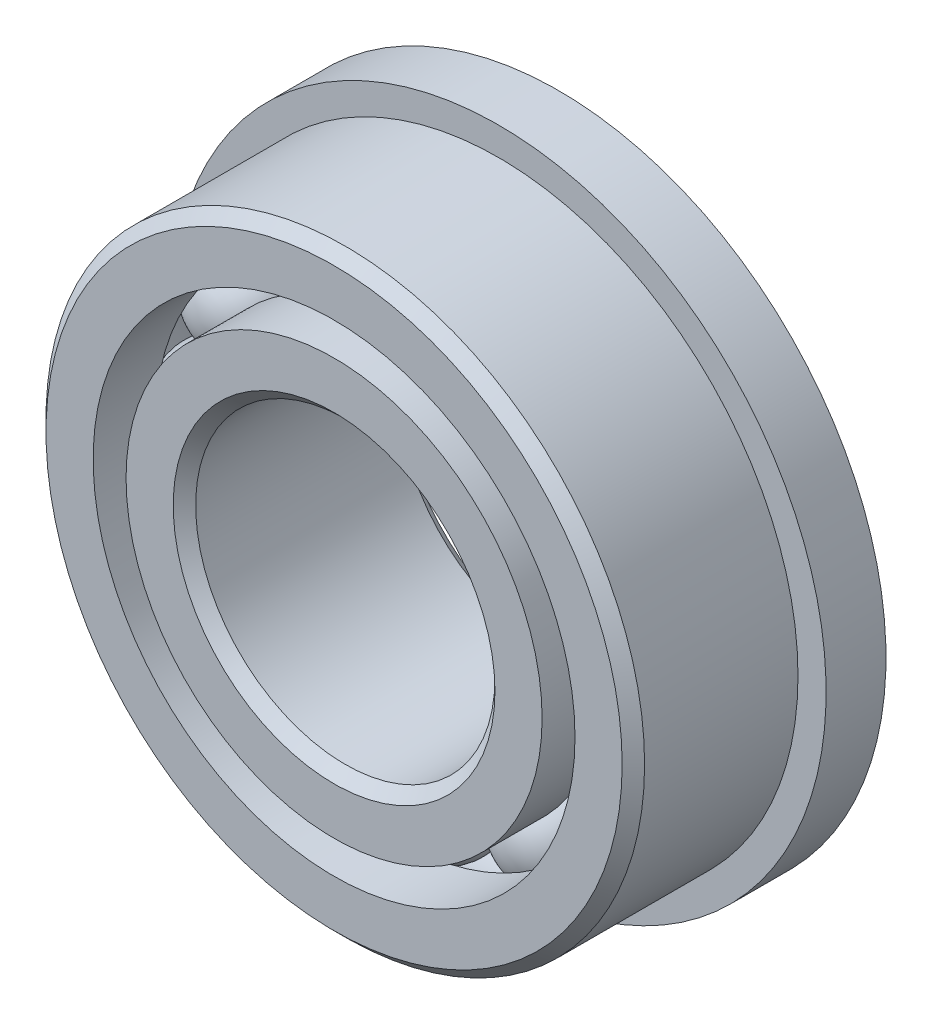
ISO-10303-21;
HEADER;
FILE_DESCRIPTION(('STEP AP214'),'2;1');
FILE_NAME('part.step','',(''),(''),'','','');
FILE_SCHEMA(('AUTOMOTIVE_DESIGN { 1 0 10303 214 1 1 1 1 }'));
ENDSEC;
DATA;
#1=APPLICATION_CONTEXT('core data for automotive mechanical design processes');
#2=APPLICATION_PROTOCOL_DEFINITION('international standard','automotive_design',2000,#1);
#3=PRODUCT_CONTEXT('',#1,'mechanical');
#4=PRODUCT('Part','Part','',(#3));
#5=PRODUCT_RELATED_PRODUCT_CATEGORY('part','',(#4));
#6=PRODUCT_DEFINITION_FORMATION('','',#4);
#7=PRODUCT_DEFINITION_CONTEXT('part definition',#1,'design');
#8=PRODUCT_DEFINITION('design','',#6,#7);
#9=PRODUCT_DEFINITION_SHAPE('','',#8);
#10=(LENGTH_UNIT() NAMED_UNIT(*) SI_UNIT(.MILLI.,.METRE.));
#11=(NAMED_UNIT(*) PLANE_ANGLE_UNIT() SI_UNIT($,.RADIAN.));
#12=(NAMED_UNIT(*) SI_UNIT($,.STERADIAN.) SOLID_ANGLE_UNIT());
#13=UNCERTAINTY_MEASURE_WITH_UNIT(LENGTH_MEASURE(1.E-05),#10,'distance_accuracy_value','');
#14=(GEOMETRIC_REPRESENTATION_CONTEXT(3) GLOBAL_UNCERTAINTY_ASSIGNED_CONTEXT((#13)) GLOBAL_UNIT_ASSIGNED_CONTEXT((#10,
#11,#12)) REPRESENTATION_CONTEXT('',''));
#15=CARTESIAN_POINT('',(0.,0.,0.));
#16=DIRECTION('',(0.,0.,1.));
#17=DIRECTION('',(1.,0.,0.));
#18=AXIS2_PLACEMENT_3D('',#15,#16,#17);
#19=CARTESIAN_POINT('',(-2.38124999999995,4.12444598552342,0.));
#20=DIRECTION('',(0.,0.,1.));
#21=DIRECTION('',(-0.499999999999989,0.866025403784445,0.));
#22=AXIS2_PLACEMENT_3D('',#19,#20,#21);
#23=SPHERICAL_SURFACE('',#22,1.11436144103197);
#24=CARTESIAN_POINT('',(-2.38124999999995,4.12444598552342,1.11436144103197));
#25=VERTEX_POINT('',#24);
#26=VERTEX_LOOP('',#25);
#27=FACE_BOUND('',#26,.T.);
#28=ADVANCED_FACE('F37',(#27),#23,.T.);
#29=CLOSED_SHELL('',(#28));
#30=MANIFOLD_SOLID_BREP('B2',#29);
#31=CARTESIAN_POINT('',(-4.12444598552336,2.38125000000005,0.));
#32=DIRECTION('',(0.,0.,1.));
#33=DIRECTION('',(-0.866025403784433,0.50000000000001,0.));
#34=AXIS2_PLACEMENT_3D('',#31,#32,#33);
#35=SPHERICAL_SURFACE('',#34,1.11436144103197);
#36=CARTESIAN_POINT('',(-4.12444598552336,2.38125000000005,1.11436144103197));
#37=VERTEX_POINT('',#36);
#38=VERTEX_LOOP('',#37);
#39=FACE_BOUND('',#38,.T.);
#40=ADVANCED_FACE('F57',(#39),#35,.T.);
#41=CLOSED_SHELL('',(#40));
#42=MANIFOLD_SOLID_BREP('B6',#41);
#43=CARTESIAN_POINT('',(-4.7625,0.,0.));
#44=DIRECTION('',(0.,0.,1.));
#45=DIRECTION('',(-1.,0.,0.));
#46=AXIS2_PLACEMENT_3D('',#43,#44,#45);
#47=SPHERICAL_SURFACE('',#46,1.11436144103197);
#48=CARTESIAN_POINT('',(-4.7625,0.,1.11436144103197));
#49=VERTEX_POINT('',#48);
#50=VERTEX_LOOP('',#49);
#51=FACE_BOUND('',#50,.T.);
#52=ADVANCED_FACE('F77',(#51),#47,.T.);
#53=CLOSED_SHELL('',(#52));
#54=MANIFOLD_SOLID_BREP('B33',#53);
#55=CARTESIAN_POINT('',(-4.12444598552341,-2.38124999999996,0.));
#56=DIRECTION('',(0.,0.,1.));
#57=DIRECTION('',(-0.866025403784443,-0.499999999999992,0.));
#58=AXIS2_PLACEMENT_3D('',#55,#56,#57);
#59=SPHERICAL_SURFACE('',#58,1.11436144103197);
#60=CARTESIAN_POINT('',(-4.12444598552341,-2.38124999999996,1.11436144103197));
#61=VERTEX_POINT('',#60);
#62=VERTEX_LOOP('',#61);
#63=FACE_BOUND('',#62,.T.);
#64=ADVANCED_FACE('F97',(#63),#59,.T.);
#65=CLOSED_SHELL('',(#64));
#66=MANIFOLD_SOLID_BREP('B53',#65);
#67=CARTESIAN_POINT('',(-2.38125000000003,-4.12444598552337,0.));
#68=DIRECTION('',(0.,0.,1.));
#69=DIRECTION('',(-0.500000000000007,-0.866025403784435,0.));
#70=AXIS2_PLACEMENT_3D('',#67,#68,#69);
#71=SPHERICAL_SURFACE('',#70,1.11436144103197);
#72=CARTESIAN_POINT('',(-2.38125000000003,-4.12444598552337,1.11436144103197));
#73=VERTEX_POINT('',#72);
#74=VERTEX_LOOP('',#73);
#75=FACE_BOUND('',#74,.T.);
#76=ADVANCED_FACE('F117',(#75),#71,.T.);
#77=CLOSED_SHELL('',(#76));
#78=MANIFOLD_SOLID_BREP('B73',#77);
#79=CARTESIAN_POINT('',(0.,-4.7625,0.));
#80=DIRECTION('',(0.,0.,1.));
#81=DIRECTION('',(0.,-1.,0.));
#82=AXIS2_PLACEMENT_3D('',#79,#80,#81);
#83=SPHERICAL_SURFACE('',#82,1.11436144103197);
#84=CARTESIAN_POINT('',(0.,-4.7625,1.11436144103197));
#85=VERTEX_POINT('',#84);
#86=VERTEX_LOOP('',#85);
#87=FACE_BOUND('',#86,.T.);
#88=ADVANCED_FACE('F137',(#87),#83,.T.);
#89=CLOSED_SHELL('',(#88));
#90=MANIFOLD_SOLID_BREP('B93',#89);
#91=CARTESIAN_POINT('',(2.38124999999998,-4.1244459855234,0.));
#92=DIRECTION('',(0.,0.,1.));
#93=DIRECTION('',(0.499999999999995,-0.866025403784442,0.));
#94=AXIS2_PLACEMENT_3D('',#91,#92,#93);
#95=SPHERICAL_SURFACE('',#94,1.11436144103197);
#96=CARTESIAN_POINT('',(2.38124999999998,-4.1244459855234,1.11436144103197));
#97=VERTEX_POINT('',#96);
#98=VERTEX_LOOP('',#97);
#99=FACE_BOUND('',#98,.T.);
#100=ADVANCED_FACE('F157',(#99),#95,.T.);
#101=CLOSED_SHELL('',(#100));
#102=MANIFOLD_SOLID_BREP('B113',#101);
#103=CARTESIAN_POINT('',(4.12444598552338,-2.38125000000002,0.));
#104=DIRECTION('',(0.,0.,1.));
#105=DIRECTION('',(0.866025403784436,-0.500000000000004,0.));
#106=AXIS2_PLACEMENT_3D('',#103,#104,#105);
#107=SPHERICAL_SURFACE('',#106,1.11436144103197);
#108=CARTESIAN_POINT('',(4.12444598552338,-2.38125000000002,1.11436144103197));
#109=VERTEX_POINT('',#108);
#110=VERTEX_LOOP('',#109);
#111=FACE_BOUND('',#110,.T.);
#112=ADVANCED_FACE('F177',(#111),#107,.T.);
#113=CLOSED_SHELL('',(#112));
#114=MANIFOLD_SOLID_BREP('B133',#113);
#115=CARTESIAN_POINT('',(4.7625,0.,0.));
#116=DIRECTION('',(0.,0.,1.));
#117=DIRECTION('',(1.,0.,0.));
#118=AXIS2_PLACEMENT_3D('',#115,#116,#117);
#119=SPHERICAL_SURFACE('',#118,1.11436144103197);
#120=CARTESIAN_POINT('',(4.7625,0.,1.11436144103197));
#121=VERTEX_POINT('',#120);
#122=VERTEX_LOOP('',#121);
#123=FACE_BOUND('',#122,.T.);
#124=ADVANCED_FACE('F197',(#123),#119,.T.);
#125=CLOSED_SHELL('',(#124));
#126=MANIFOLD_SOLID_BREP('B153',#125);
#127=CARTESIAN_POINT('',(4.12444598552339,2.38124999999999,0.));
#128=DIRECTION('',(0.,0.,1.));
#129=DIRECTION('',(0.86602540378444,0.499999999999998,0.));
#130=AXIS2_PLACEMENT_3D('',#127,#128,#129);
#131=SPHERICAL_SURFACE('',#130,1.11436144103197);
#132=CARTESIAN_POINT('',(4.12444598552339,2.38124999999999,1.11436144103197));
#133=VERTEX_POINT('',#132);
#134=VERTEX_LOOP('',#133);
#135=FACE_BOUND('',#134,.T.);
#136=ADVANCED_FACE('F217',(#135),#131,.T.);
#137=CLOSED_SHELL('',(#136));
#138=MANIFOLD_SOLID_BREP('B173',#137);
#139=CARTESIAN_POINT('',(2.38125,4.12444598552339,0.));
#140=DIRECTION('',(0.,0.,1.));
#141=DIRECTION('',(0.500000000000001,0.866025403784438,0.));
#142=AXIS2_PLACEMENT_3D('',#139,#140,#141);
#143=SPHERICAL_SURFACE('',#142,1.11436144103197);
#144=CARTESIAN_POINT('',(2.38125,4.12444598552339,1.11436144103197));
#145=VERTEX_POINT('',#144);
#146=VERTEX_LOOP('',#145);
#147=FACE_BOUND('',#146,.T.);
#148=ADVANCED_FACE('F237',(#147),#143,.T.);
#149=CLOSED_SHELL('',(#148));
#150=MANIFOLD_SOLID_BREP('B193',#149);
#151=CARTESIAN_POINT('',(0.,4.7625,0.));
#152=DIRECTION('',(0.,0.,1.));
#153=DIRECTION('',(0.,1.,0.));
#154=AXIS2_PLACEMENT_3D('',#151,#152,#153);
#155=SPHERICAL_SURFACE('',#154,1.11436144103197);
#156=CARTESIAN_POINT('',(0.,4.7625,1.11436144103197));
#157=VERTEX_POINT('',#156);
#158=VERTEX_LOOP('',#157);
#159=FACE_BOUND('',#158,.T.);
#160=ADVANCED_FACE('F259',(#159),#155,.T.);
#161=CLOSED_SHELL('',(#160));
#162=MANIFOLD_SOLID_BREP('B213',#161);
#163=CARTESIAN_POINT('',(0.,4.4135989010989,2.38125));
#164=DIRECTION('',(0.,0.,-1.));
#165=DIRECTION('',(-1.,0.,0.));
#166=AXIS2_PLACEMENT_3D('',#163,#164,#165);
#167=PLANE('',#166);
#168=CARTESIAN_POINT('',(0.,0.,2.38125));
#169=DIRECTION('',(0.,0.,1.));
#170=DIRECTION('',(1.,0.,0.));
#171=AXIS2_PLACEMENT_3D('',#168,#169,#170);
#172=CIRCLE('',#171,3.413125);
#173=CARTESIAN_POINT('',(3.413125,0.,2.38125));
#174=VERTEX_POINT('',#173);
#175=EDGE_CURVE('E306',#174,#174,#172,.T.);
#176=ORIENTED_EDGE('',*,*,#175,.F.);
#177=EDGE_LOOP('',(#176));
#178=FACE_BOUND('',#177,.T.);
#179=CARTESIAN_POINT('',(0.,0.,2.38125));
#180=DIRECTION('',(0.,0.,1.));
#181=DIRECTION('',(1.,0.,0.));
#182=AXIS2_PLACEMENT_3D('',#179,#180,#181);
#183=CIRCLE('',#182,4.4135989010989);
#184=CARTESIAN_POINT('',(4.4135989010989,0.,2.38125));
#185=VERTEX_POINT('',#184);
#186=EDGE_CURVE('E258',#185,#185,#183,.T.);
#187=ORIENTED_EDGE('',*,*,#186,.T.);
#188=EDGE_LOOP('',(#187));
#189=FACE_BOUND('',#188,.T.);
#190=ADVANCED_FACE('F278',(#178,#189),#167,.F.);
#191=CARTESIAN_POINT('',(0.,0.,2.38125));
#192=DIRECTION('',(0.,0.,1.));
#193=DIRECTION('',(1.,0.,0.));
#194=AXIS2_PLACEMENT_3D('',#191,#192,#193);
#195=CYLINDRICAL_SURFACE('',#194,4.4135989010989);
#196=ORIENTED_EDGE('',*,*,#186,.F.);
#197=EDGE_LOOP('',(#196));
#198=FACE_BOUND('',#197,.T.);
#199=CARTESIAN_POINT('',(0.,0.,1.05833333333333));
#200=DIRECTION('',(0.,0.,1.));
#201=DIRECTION('',(1.,0.,0.));
#202=AXIS2_PLACEMENT_3D('',#199,#200,#201);
#203=CIRCLE('',#202,4.4135989010989);
#204=CARTESIAN_POINT('',(4.4135989010989,0.,1.05833333333333));
#205=VERTEX_POINT('',#204);
#206=EDGE_CURVE('E284',#205,#205,#203,.T.);
#207=ORIENTED_EDGE('',*,*,#206,.T.);
#208=EDGE_LOOP('',(#207));
#209=FACE_BOUND('',#208,.T.);
#210=ADVANCED_FACE('F313',(#198,#209),#195,.T.);
#211=CARTESIAN_POINT('',(0.,0.,0.));
#212=DIRECTION('',(0.,0.,1.));
#213=DIRECTION('',(1.,0.,0.));
#214=AXIS2_PLACEMENT_3D('',#211,#212,#213);
#215=TOROIDAL_SURFACE('',#214,4.7625,1.11436144103197);
#216=ORIENTED_EDGE('',*,*,#206,.F.);
#217=EDGE_LOOP('',(#216));
#218=FACE_BOUND('',#217,.T.);
#219=CARTESIAN_POINT('',(0.,0.,-1.05833333333333));
#220=DIRECTION('',(0.,0.,1.));
#221=DIRECTION('',(1.,0.,0.));
#222=AXIS2_PLACEMENT_3D('',#219,#220,#221);
#223=CIRCLE('',#222,4.4135989010989);
#224=CARTESIAN_POINT('',(4.4135989010989,0.,-1.05833333333333));
#225=VERTEX_POINT('',#224);
#226=EDGE_CURVE('E288',#225,#225,#223,.T.);
#227=ORIENTED_EDGE('',*,*,#226,.T.);
#228=EDGE_LOOP('',(#227));
#229=FACE_BOUND('',#228,.T.);
#230=ADVANCED_FACE('F317',(#218,#229),#215,.F.);
#231=CARTESIAN_POINT('',(0.,0.,2.38125));
#232=DIRECTION('',(0.,0.,1.));
#233=DIRECTION('',(1.,0.,0.));
#234=AXIS2_PLACEMENT_3D('',#231,#232,#233);
#235=CYLINDRICAL_SURFACE('',#234,4.4135989010989);
#236=ORIENTED_EDGE('',*,*,#226,.F.);
#237=EDGE_LOOP('',(#236));
#238=FACE_BOUND('',#237,.T.);
#239=CARTESIAN_POINT('',(0.,0.,-2.38125));
#240=DIRECTION('',(0.,0.,1.));
#241=DIRECTION('',(1.,0.,0.));
#242=AXIS2_PLACEMENT_3D('',#239,#240,#241);
#243=CIRCLE('',#242,4.4135989010989);
#244=CARTESIAN_POINT('',(4.4135989010989,0.,-2.38125));
#245=VERTEX_POINT('',#244);
#246=EDGE_CURVE('E292',#245,#245,#243,.T.);
#247=ORIENTED_EDGE('',*,*,#246,.T.);
#248=EDGE_LOOP('',(#247));
#249=FACE_BOUND('',#248,.T.);
#250=ADVANCED_FACE('F322',(#238,#249),#235,.T.);
#251=CARTESIAN_POINT('',(0.,3.413125,-2.38125));
#252=DIRECTION('',(0.,0.,1.));
#253=DIRECTION('',(1.,0.,0.));
#254=AXIS2_PLACEMENT_3D('',#251,#252,#253);
#255=PLANE('',#254);
#256=ORIENTED_EDGE('',*,*,#246,.F.);
#257=EDGE_LOOP('',(#256));
#258=FACE_BOUND('',#257,.T.);
#259=CARTESIAN_POINT('',(0.,0.,-2.38125));
#260=DIRECTION('',(0.,0.,1.));
#261=DIRECTION('',(1.,0.,0.));
#262=AXIS2_PLACEMENT_3D('',#259,#260,#261);
#263=CIRCLE('',#262,3.413125);
#264=CARTESIAN_POINT('',(3.413125,0.,-2.38125));
#265=VERTEX_POINT('',#264);
#266=EDGE_CURVE('E297',#265,#265,#263,.T.);
#267=ORIENTED_EDGE('',*,*,#266,.T.);
#268=EDGE_LOOP('',(#267));
#269=FACE_BOUND('',#268,.T.);
#270=ADVANCED_FACE('F328',(#258,#269),#255,.F.);
#271=CARTESIAN_POINT('',(0.,0.,-2.143125));
#272=DIRECTION('',(0.,0.,-1.));
#273=DIRECTION('',(-1.,0.,0.));
#274=AXIS2_PLACEMENT_3D('',#271,#272,#273);
#275=CONICAL_SURFACE('',#274,3.175,0.785398163397447);
#276=ORIENTED_EDGE('',*,*,#266,.F.);
#277=EDGE_LOOP('',(#276));
#278=FACE_BOUND('',#277,.T.);
#279=CARTESIAN_POINT('',(0.,0.,-2.143125));
#280=DIRECTION('',(0.,0.,1.));
#281=DIRECTION('',(1.,0.,0.));
#282=AXIS2_PLACEMENT_3D('',#279,#280,#281);
#283=CIRCLE('',#282,3.175);
#284=CARTESIAN_POINT('',(3.175,0.,-2.143125));
#285=VERTEX_POINT('',#284);
#286=EDGE_CURVE('E300',#285,#285,#283,.T.);
#287=ORIENTED_EDGE('',*,*,#286,.T.);
#288=EDGE_LOOP('',(#287));
#289=FACE_BOUND('',#288,.T.);
#290=ADVANCED_FACE('F332',(#278,#289),#275,.F.);
#291=CARTESIAN_POINT('',(0.,0.,2.38125));
#292=DIRECTION('',(0.,0.,1.));
#293=DIRECTION('',(1.,0.,0.));
#294=AXIS2_PLACEMENT_3D('',#291,#292,#293);
#295=CYLINDRICAL_SURFACE('',#294,3.175);
#296=ORIENTED_EDGE('',*,*,#286,.F.);
#297=EDGE_LOOP('',(#296));
#298=FACE_BOUND('',#297,.T.);
#299=CARTESIAN_POINT('',(0.,0.,2.143125));
#300=DIRECTION('',(0.,0.,1.));
#301=DIRECTION('',(1.,0.,0.));
#302=AXIS2_PLACEMENT_3D('',#299,#300,#301);
#303=CIRCLE('',#302,3.175);
#304=CARTESIAN_POINT('',(3.175,0.,2.143125));
#305=VERTEX_POINT('',#304);
#306=EDGE_CURVE('E303',#305,#305,#303,.T.);
#307=ORIENTED_EDGE('',*,*,#306,.T.);
#308=EDGE_LOOP('',(#307));
#309=FACE_BOUND('',#308,.T.);
#310=ADVANCED_FACE('F336',(#298,#309),#295,.F.);
#311=CARTESIAN_POINT('',(0.,0.,2.38125));
#312=DIRECTION('',(0.,0.,1.));
#313=DIRECTION('',(1.,0.,0.));
#314=AXIS2_PLACEMENT_3D('',#311,#312,#313);
#315=CONICAL_SURFACE('',#314,3.413125,0.785398163397451);
#316=ORIENTED_EDGE('',*,*,#306,.F.);
#317=EDGE_LOOP('',(#316));
#318=FACE_BOUND('',#317,.T.);
#319=ORIENTED_EDGE('',*,*,#175,.T.);
#320=EDGE_LOOP('',(#319));
#321=FACE_BOUND('',#320,.T.);
#322=ADVANCED_FACE('F310',(#318,#321),#315,.F.);
#323=CLOSED_SHELL('',(#190,#210,#230,#250,#270,#290,#310,#322));
#324=MANIFOLD_SOLID_BREP('B233',#323);
#325=CARTESIAN_POINT('',(0.,0.,2.143125));
#326=DIRECTION('',(0.,0.,-1.));
#327=DIRECTION('',(-1.,0.,0.));
#328=AXIS2_PLACEMENT_3D('',#325,#326,#327);
#329=CONICAL_SURFACE('',#328,6.35,0.785398163397447);
#330=CARTESIAN_POINT('',(0.,0.,2.38125));
#331=DIRECTION('',(0.,0.,1.));
#332=DIRECTION('',(1.,0.,0.));
#333=AXIS2_PLACEMENT_3D('',#330,#331,#332);
#334=CIRCLE('',#333,6.111875);
#335=CARTESIAN_POINT('',(6.111875,0.,2.38125));
#336=VERTEX_POINT('',#335);
#337=EDGE_CURVE('E421',#336,#336,#334,.T.);
#338=ORIENTED_EDGE('',*,*,#337,.F.);
#339=EDGE_LOOP('',(#338));
#340=FACE_BOUND('',#339,.T.);
#341=CARTESIAN_POINT('',(0.,0.,2.143125));
#342=DIRECTION('',(0.,0.,1.));
#343=DIRECTION('',(1.,0.,0.));
#344=AXIS2_PLACEMENT_3D('',#341,#342,#343);
#345=CIRCLE('',#344,6.35);
#346=CARTESIAN_POINT('',(6.35,0.,2.143125));
#347=VERTEX_POINT('',#346);
#348=EDGE_CURVE('E277',#347,#347,#345,.T.);
#349=ORIENTED_EDGE('',*,*,#348,.T.);
#350=EDGE_LOOP('',(#349));
#351=FACE_BOUND('',#350,.T.);
#352=ADVANCED_FACE('F399',(#340,#351),#329,.T.);
#353=CARTESIAN_POINT('',(0.,0.,2.38125));
#354=DIRECTION('',(0.,0.,1.));
#355=DIRECTION('',(1.,0.,0.));
#356=AXIS2_PLACEMENT_3D('',#353,#354,#355);
#357=CYLINDRICAL_SURFACE('',#356,6.35);
#358=CARTESIAN_POINT('',(0.,0.,-1.11125));
#359=DIRECTION('',(0.,0.,1.));
#360=DIRECTION('',(1.,0.,0.));
#361=AXIS2_PLACEMENT_3D('',#358,#359,#360);
#362=CIRCLE('',#361,6.35);
#363=CARTESIAN_POINT('',(6.35,0.,-1.11125));
#364=VERTEX_POINT('',#363);
#365=EDGE_CURVE('E402',#364,#364,#362,.T.);
#366=ORIENTED_EDGE('',*,*,#365,.T.);
#367=EDGE_LOOP('',(#366));
#368=FACE_BOUND('',#367,.T.);
#369=ORIENTED_EDGE('',*,*,#348,.F.);
#370=EDGE_LOOP('',(#369));
#371=FACE_BOUND('',#370,.T.);
#372=ADVANCED_FACE('F442',(#368,#371),#357,.T.);
#373=CARTESIAN_POINT('',(0.,6.111875,-2.38125));
#374=DIRECTION('',(0.,0.,1.));
#375=DIRECTION('',(1.,0.,0.));
#376=AXIS2_PLACEMENT_3D('',#373,#374,#375);
#377=PLANE('',#376);
#378=CARTESIAN_POINT('',(0.,0.,-2.38125));
#379=DIRECTION('',(0.,0.,1.));
#380=DIRECTION('',(1.,0.,0.));
#381=AXIS2_PLACEMENT_3D('',#378,#379,#380);
#382=CIRCLE('',#381,5.1114010989011);
#383=CARTESIAN_POINT('',(5.1114010989011,0.,-2.38125));
#384=VERTEX_POINT('',#383);
#385=EDGE_CURVE('E406',#384,#384,#382,.T.);
#386=ORIENTED_EDGE('',*,*,#385,.T.);
#387=EDGE_LOOP('',(#386));
#388=FACE_BOUND('',#387,.T.);
#389=CARTESIAN_POINT('',(0.,0.,-2.38125));
#390=DIRECTION('',(0.,0.,-1.));
#391=DIRECTION('',(-1.,0.,0.));
#392=AXIS2_PLACEMENT_3D('',#389,#390,#391);
#393=CIRCLE('',#392,6.9469);
#394=CARTESIAN_POINT('',(-6.9469,0.,-2.38125));
#395=VERTEX_POINT('',#394);
#396=EDGE_CURVE('E424',#395,#395,#393,.T.);
#397=ORIENTED_EDGE('',*,*,#396,.T.);
#398=EDGE_LOOP('',(#397));
#399=FACE_BOUND('',#398,.T.);
#400=ADVANCED_FACE('F445',(#388,#399),#377,.F.);
#401=CARTESIAN_POINT('',(0.,0.,2.38125));
#402=DIRECTION('',(0.,0.,1.));
#403=DIRECTION('',(1.,0.,0.));
#404=AXIS2_PLACEMENT_3D('',#401,#402,#403);
#405=CYLINDRICAL_SURFACE('',#404,5.1114010989011);
#406=ORIENTED_EDGE('',*,*,#385,.F.);
#407=EDGE_LOOP('',(#406));
#408=FACE_BOUND('',#407,.T.);
#409=CARTESIAN_POINT('',(0.,0.,-1.05833333333333));
#410=DIRECTION('',(0.,0.,1.));
#411=DIRECTION('',(1.,0.,0.));
#412=AXIS2_PLACEMENT_3D('',#409,#410,#411);
#413=CIRCLE('',#412,5.1114010989011);
#414=CARTESIAN_POINT('',(5.1114010989011,0.,-1.05833333333333));
#415=VERTEX_POINT('',#414);
#416=EDGE_CURVE('E410',#415,#415,#413,.T.);
#417=ORIENTED_EDGE('',*,*,#416,.T.);
#418=EDGE_LOOP('',(#417));
#419=FACE_BOUND('',#418,.T.);
#420=ADVANCED_FACE('F450',(#408,#419),#405,.F.);
#421=CARTESIAN_POINT('',(0.,0.,0.));
#422=DIRECTION('',(0.,0.,1.));
#423=DIRECTION('',(1.,0.,0.));
#424=AXIS2_PLACEMENT_3D('',#421,#422,#423);
#425=TOROIDAL_SURFACE('',#424,4.7625,1.11436144103197);
#426=ORIENTED_EDGE('',*,*,#416,.F.);
#427=EDGE_LOOP('',(#426));
#428=FACE_BOUND('',#427,.T.);
#429=CARTESIAN_POINT('',(0.,0.,1.05833333333333));
#430=DIRECTION('',(0.,0.,1.));
#431=DIRECTION('',(1.,0.,0.));
#432=AXIS2_PLACEMENT_3D('',#429,#430,#431);
#433=CIRCLE('',#432,5.1114010989011);
#434=CARTESIAN_POINT('',(5.1114010989011,0.,1.05833333333333));
#435=VERTEX_POINT('',#434);
#436=EDGE_CURVE('E415',#435,#435,#433,.T.);
#437=ORIENTED_EDGE('',*,*,#436,.T.);
#438=EDGE_LOOP('',(#437));
#439=FACE_BOUND('',#438,.T.);
#440=ADVANCED_FACE('F457',(#428,#439),#425,.F.);
#441=CARTESIAN_POINT('',(0.,0.,2.38125));
#442=DIRECTION('',(0.,0.,1.));
#443=DIRECTION('',(1.,0.,0.));
#444=AXIS2_PLACEMENT_3D('',#441,#442,#443);
#445=CYLINDRICAL_SURFACE('',#444,5.1114010989011);
#446=ORIENTED_EDGE('',*,*,#436,.F.);
#447=EDGE_LOOP('',(#446));
#448=FACE_BOUND('',#447,.T.);
#449=CARTESIAN_POINT('',(0.,0.,2.38125));
#450=DIRECTION('',(0.,0.,1.));
#451=DIRECTION('',(1.,0.,0.));
#452=AXIS2_PLACEMENT_3D('',#449,#450,#451);
#453=CIRCLE('',#452,5.1114010989011);
#454=CARTESIAN_POINT('',(5.1114010989011,0.,2.38125));
#455=VERTEX_POINT('',#454);
#456=EDGE_CURVE('E418',#455,#455,#453,.T.);
#457=ORIENTED_EDGE('',*,*,#456,.T.);
#458=EDGE_LOOP('',(#457));
#459=FACE_BOUND('',#458,.T.);
#460=ADVANCED_FACE('F461',(#448,#459),#445,.F.);
#461=CARTESIAN_POINT('',(0.,6.111875,2.38125));
#462=DIRECTION('',(0.,0.,-1.));
#463=DIRECTION('',(-1.,0.,0.));
#464=AXIS2_PLACEMENT_3D('',#461,#462,#463);
#465=PLANE('',#464);
#466=ORIENTED_EDGE('',*,*,#456,.F.);
#467=EDGE_LOOP('',(#466));
#468=FACE_BOUND('',#467,.T.);
#469=ORIENTED_EDGE('',*,*,#337,.T.);
#470=EDGE_LOOP('',(#469));
#471=FACE_BOUND('',#470,.T.);
#472=ADVANCED_FACE('F437',(#468,#471),#465,.F.);
#473=CARTESIAN_POINT('',(0.,5.61163804945055,-1.11125));
#474=DIRECTION('',(0.,0.,1.));
#475=DIRECTION('',(1.,0.,0.));
#476=AXIS2_PLACEMENT_3D('',#473,#474,#475);
#477=PLANE('',#476);
#478=CARTESIAN_POINT('',(0.,0.,-1.11125));
#479=DIRECTION('',(0.,0.,-1.));
#480=DIRECTION('',(-1.,0.,0.));
#481=AXIS2_PLACEMENT_3D('',#478,#479,#480);
#482=CIRCLE('',#481,6.9469);
#483=CARTESIAN_POINT('',(-6.9469,0.,-1.11125));
#484=VERTEX_POINT('',#483);
#485=EDGE_CURVE('E427',#484,#484,#482,.T.);
#486=ORIENTED_EDGE('',*,*,#485,.F.);
#487=EDGE_LOOP('',(#486));
#488=FACE_BOUND('',#487,.T.);
#489=ORIENTED_EDGE('',*,*,#365,.F.);
#490=EDGE_LOOP('',(#489));
#491=FACE_BOUND('',#490,.T.);
#492=ADVANCED_FACE('F434',(#488,#491),#477,.T.);
#493=CARTESIAN_POINT('',(0.,0.,-2.38125));
#494=DIRECTION('',(0.,0.,-1.));
#495=DIRECTION('',(-1.,0.,0.));
#496=AXIS2_PLACEMENT_3D('',#493,#494,#495);
#497=CYLINDRICAL_SURFACE('',#496,6.9469);
#498=ORIENTED_EDGE('',*,*,#485,.T.);
#499=EDGE_LOOP('',(#498));
#500=FACE_BOUND('',#499,.T.);
#501=ORIENTED_EDGE('',*,*,#396,.F.);
#502=EDGE_LOOP('',(#501));
#503=FACE_BOUND('',#502,.T.);
#504=ADVANCED_FACE('F431',(#500,#503),#497,.T.);
#505=CLOSED_SHELL('',(#352,#372,#400,#420,#440,#460,#472,#492,#504));
#506=MANIFOLD_SOLID_BREP('B253',#505);
#507=ADVANCED_BREP_SHAPE_REPRESENTATION('',(#18,#30,#42,#54,#66,#78,#90,#102,#114,#126,#138,
#150,#162,#324,#506),#14);
#508=SHAPE_DEFINITION_REPRESENTATION(#9,#507);
ENDSEC;
END-ISO-10303-21;
